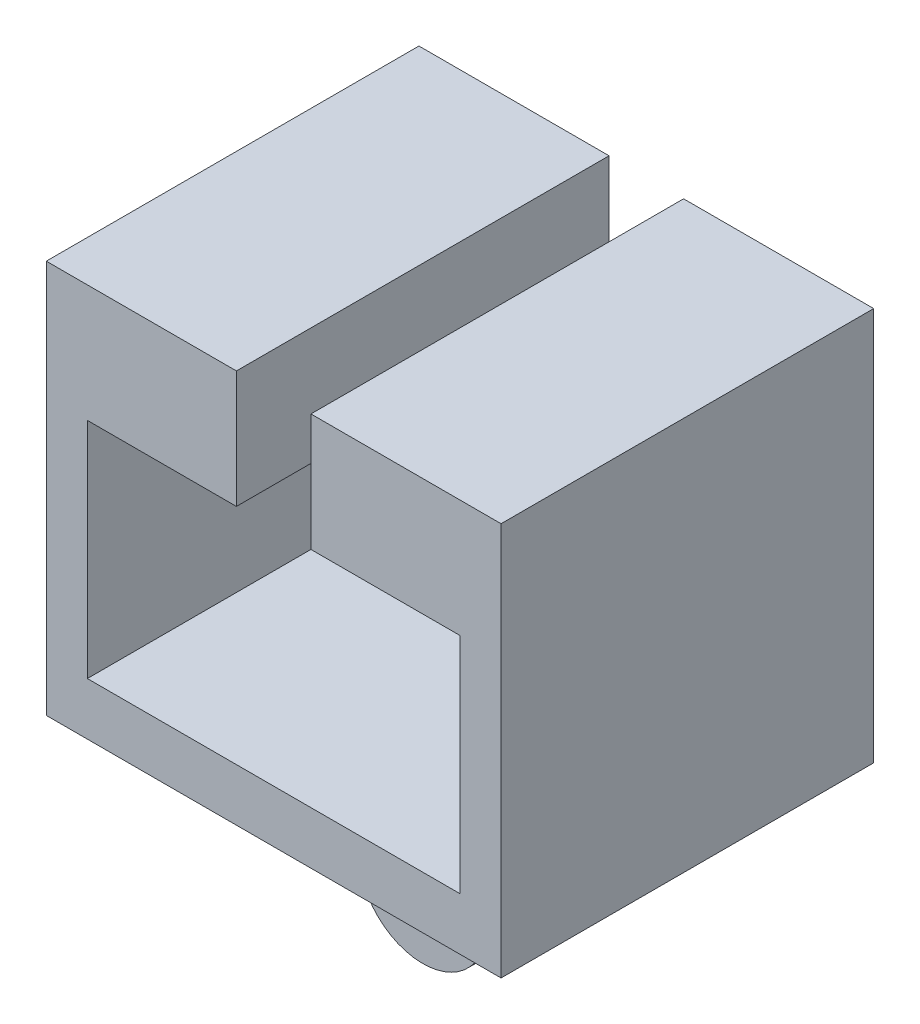
ISO-10303-21;
HEADER;
FILE_DESCRIPTION(('STEP AP214'),'2;1');
FILE_NAME('part.step','',(''),(''),'','','');
FILE_SCHEMA(('AUTOMOTIVE_DESIGN { 1 0 10303 214 1 1 1 1 }'));
ENDSEC;
DATA;
#1=APPLICATION_CONTEXT('core data for automotive mechanical design processes');
#2=APPLICATION_PROTOCOL_DEFINITION('international standard','automotive_design',2000,#1);
#3=PRODUCT_CONTEXT('',#1,'mechanical');
#4=PRODUCT('Part','Part','',(#3));
#5=PRODUCT_RELATED_PRODUCT_CATEGORY('part','',(#4));
#6=PRODUCT_DEFINITION_FORMATION('','',#4);
#7=PRODUCT_DEFINITION_CONTEXT('part definition',#1,'design');
#8=PRODUCT_DEFINITION('design','',#6,#7);
#9=PRODUCT_DEFINITION_SHAPE('','',#8);
#10=(LENGTH_UNIT() NAMED_UNIT(*) SI_UNIT(.MILLI.,.METRE.));
#11=(NAMED_UNIT(*) PLANE_ANGLE_UNIT() SI_UNIT($,.RADIAN.));
#12=(NAMED_UNIT(*) SI_UNIT($,.STERADIAN.) SOLID_ANGLE_UNIT());
#13=UNCERTAINTY_MEASURE_WITH_UNIT(LENGTH_MEASURE(1.E-05),#10,'distance_accuracy_value','');
#14=(GEOMETRIC_REPRESENTATION_CONTEXT(3) GLOBAL_UNCERTAINTY_ASSIGNED_CONTEXT((#13)) GLOBAL_UNIT_ASSIGNED_CONTEXT((#10,
#11,#12)) REPRESENTATION_CONTEXT('',''));
#15=CARTESIAN_POINT('',(0.,0.,0.));
#16=DIRECTION('',(0.,0.,1.));
#17=DIRECTION('',(1.,0.,0.));
#18=AXIS2_PLACEMENT_3D('',#15,#16,#17);
#19=CARTESIAN_POINT('',(0.,0.,-38.1));
#20=DIRECTION('',(0.,0.,1.));
#21=DIRECTION('',(1.,0.,0.));
#22=AXIS2_PLACEMENT_3D('',#19,#20,#21);
#23=CYLINDRICAL_SURFACE('',#22,10.8950456396128);
#24=DIRECTION('',(0.,0.,1.));
#25=VECTOR('',#24,1.);
#26=CARTESIAN_POINT('',(10.8950456396128,0.,-38.1));
#27=LINE('',#26,#25);
#28=CARTESIAN_POINT('',(10.8950456396128,0.,-35.6530617297002));
#29=VERTEX_POINT('',#28);
#30=CARTESIAN_POINT('',(10.8950456396128,0.,-38.1));
#31=VERTEX_POINT('',#30);
#32=EDGE_CURVE('E12',#29,#31,#27,.F.);
#33=ORIENTED_EDGE('',*,*,#32,.F.);
#34=CARTESIAN_POINT('',(0.,0.,-35.6530617297002));
#35=DIRECTION('',(0.,0.,-1.));
#36=DIRECTION('',(-1.,0.,0.));
#37=AXIS2_PLACEMENT_3D('',#34,#35,#36);
#38=CIRCLE('',#37,10.8950456396128);
#39=CARTESIAN_POINT('',(-10.8950456396128,0.,-35.6530617297002));
#40=VERTEX_POINT('',#39);
#41=EDGE_CURVE('E266',#29,#40,#38,.F.);
#42=ORIENTED_EDGE('',*,*,#41,.T.);
#43=DIRECTION('',(0.,0.,1.));
#44=VECTOR('',#43,1.);
#45=CARTESIAN_POINT('',(-10.8950456396128,0.,-38.1));
#46=LINE('',#45,#44);
#47=CARTESIAN_POINT('',(-10.8950456396128,0.,-38.1));
#48=VERTEX_POINT('',#47);
#49=EDGE_CURVE('E257',#48,#40,#46,.T.);
#50=ORIENTED_EDGE('',*,*,#49,.F.);
#51=CARTESIAN_POINT('',(0.,0.,-38.1));
#52=DIRECTION('',(0.,0.,1.));
#53=DIRECTION('',(1.,0.,0.));
#54=AXIS2_PLACEMENT_3D('',#51,#52,#53);
#55=CIRCLE('',#54,10.8950456396128);
#56=EDGE_CURVE('E563',#48,#31,#55,.T.);
#57=ORIENTED_EDGE('',*,*,#56,.T.);
#58=EDGE_LOOP('',(#33,#42,#50,#57));
#59=FACE_BOUND('',#58,.T.);
#60=CARTESIAN_POINT('',(0.,0.,0.));
#61=DIRECTION('',(0.,0.,1.));
#62=DIRECTION('',(1.,0.,0.));
#63=AXIS2_PLACEMENT_3D('',#60,#61,#62);
#64=CIRCLE('',#63,10.8950456396128);
#65=CARTESIAN_POINT('',(10.8950456396128,0.,0.));
#66=VERTEX_POINT('',#65);
#67=EDGE_CURVE('E552',#66,#66,#64,.T.);
#68=ORIENTED_EDGE('',*,*,#67,.F.);
#69=EDGE_LOOP('',(#68));
#70=FACE_BOUND('',#69,.T.);
#71=ADVANCED_FACE('F247',(#59,#70),#23,.T.);
#72=CARTESIAN_POINT('',(0.,0.,-38.1));
#73=DIRECTION('',(0.,0.,1.));
#74=DIRECTION('',(1.,0.,0.));
#75=AXIS2_PLACEMENT_3D('',#72,#73,#74);
#76=PLANE('',#75);
#77=ORIENTED_EDGE('',*,*,#56,.F.);
#78=DIRECTION('',(-1.,0.,0.));
#79=VECTOR('',#78,1.);
#80=CARTESIAN_POINT('',(11.176,0.,-38.1));
#81=LINE('',#80,#79);
#82=CARTESIAN_POINT('',(-11.176,0.,-38.1));
#83=VERTEX_POINT('',#82);
#84=EDGE_CURVE('E542',#48,#83,#81,.T.);
#85=ORIENTED_EDGE('',*,*,#84,.T.);
#86=DIRECTION('',(0.,1.,0.));
#87=VECTOR('',#86,1.);
#88=CARTESIAN_POINT('',(-11.176,0.,-38.1));
#89=LINE('',#88,#87);
#90=CARTESIAN_POINT('',(-11.176,19.05,-38.1));
#91=VERTEX_POINT('',#90);
#92=EDGE_CURVE('E528',#83,#91,#89,.T.);
#93=ORIENTED_EDGE('',*,*,#92,.T.);
#94=DIRECTION('',(-1.,0.,0.));
#95=VECTOR('',#94,1.);
#96=CARTESIAN_POINT('',(31.75,19.05,-38.1));
#97=LINE('',#96,#95);
#98=CARTESIAN_POINT('',(-38.7472451790634,19.05,-38.1));
#99=VERTEX_POINT('',#98);
#100=EDGE_CURVE('E512',#91,#99,#97,.T.);
#101=ORIENTED_EDGE('',*,*,#100,.T.);
#102=DIRECTION('',(0.,1.,0.));
#103=VECTOR('',#102,1.);
#104=CARTESIAN_POINT('',(-38.7472451790634,86.0903845049923,-38.1));
#105=LINE('',#104,#103);
#106=CARTESIAN_POINT('',(-38.7472451790634,86.0903845049923,-38.1));
#107=VERTEX_POINT('',#106);
#108=EDGE_CURVE('E416',#99,#107,#105,.T.);
#109=ORIENTED_EDGE('',*,*,#108,.T.);
#110=DIRECTION('',(1.,0.,0.));
#111=VECTOR('',#110,1.);
#112=CARTESIAN_POINT('',(-6.35,86.0903845049923,-38.1));
#113=LINE('',#112,#111);
#114=CARTESIAN_POINT('',(-6.35,86.0903845049923,-38.1));
#115=VERTEX_POINT('',#114);
#116=EDGE_CURVE('E473',#107,#115,#113,.T.);
#117=ORIENTED_EDGE('',*,*,#116,.T.);
#118=DIRECTION('',(0.,-1.,0.));
#119=VECTOR('',#118,1.);
#120=CARTESIAN_POINT('',(-6.35,66.093070635788,-38.1));
#121=LINE('',#120,#119);
#122=CARTESIAN_POINT('',(-6.35,66.093070635788,-38.1));
#123=VERTEX_POINT('',#122);
#124=EDGE_CURVE('E472',#115,#123,#121,.T.);
#125=ORIENTED_EDGE('',*,*,#124,.T.);
#126=DIRECTION('',(-1.,0.,0.));
#127=VECTOR('',#126,1.);
#128=CARTESIAN_POINT('',(-31.75,66.093070635788,-38.1));
#129=LINE('',#128,#127);
#130=CARTESIAN_POINT('',(-31.75,66.093070635788,-38.1));
#131=VERTEX_POINT('',#130);
#132=EDGE_CURVE('E467',#123,#131,#129,.T.);
#133=ORIENTED_EDGE('',*,*,#132,.T.);
#134=DIRECTION('',(0.,-1.,0.));
#135=VECTOR('',#134,1.);
#136=CARTESIAN_POINT('',(-31.75,27.993070635788,-38.1));
#137=LINE('',#136,#135);
#138=CARTESIAN_POINT('',(-31.75,27.993070635788,-38.1));
#139=VERTEX_POINT('',#138);
#140=EDGE_CURVE('E465',#131,#139,#137,.T.);
#141=ORIENTED_EDGE('',*,*,#140,.T.);
#142=DIRECTION('',(1.,0.,0.));
#143=VECTOR('',#142,1.);
#144=CARTESIAN_POINT('',(31.75,27.993070635788,-38.1));
#145=LINE('',#144,#143);
#146=CARTESIAN_POINT('',(31.75,27.993070635788,-38.1));
#147=VERTEX_POINT('',#146);
#148=EDGE_CURVE('E436',#139,#147,#145,.T.);
#149=ORIENTED_EDGE('',*,*,#148,.T.);
#150=DIRECTION('',(0.,1.,0.));
#151=VECTOR('',#150,1.);
#152=CARTESIAN_POINT('',(31.75,27.993070635788,-38.1));
#153=LINE('',#152,#151);
#154=CARTESIAN_POINT('',(31.75,66.093070635788,-38.1));
#155=VERTEX_POINT('',#154);
#156=EDGE_CURVE('E413',#147,#155,#153,.T.);
#157=ORIENTED_EDGE('',*,*,#156,.T.);
#158=DIRECTION('',(-1.,0.,0.));
#159=VECTOR('',#158,1.);
#160=CARTESIAN_POINT('',(31.75,66.093070635788,-38.1));
#161=LINE('',#160,#159);
#162=CARTESIAN_POINT('',(6.35,66.093070635788,-38.1));
#163=VERTEX_POINT('',#162);
#164=EDGE_CURVE('E392',#155,#163,#161,.T.);
#165=ORIENTED_EDGE('',*,*,#164,.T.);
#166=DIRECTION('',(0.,1.,0.));
#167=VECTOR('',#166,1.);
#168=CARTESIAN_POINT('',(6.35,66.093070635788,-38.1));
#169=LINE('',#168,#167);
#170=CARTESIAN_POINT('',(6.35,86.0903845049923,-38.1));
#171=VERTEX_POINT('',#170);
#172=EDGE_CURVE('E423',#163,#171,#169,.T.);
#173=ORIENTED_EDGE('',*,*,#172,.T.);
#174=DIRECTION('',(1.,0.,0.));
#175=VECTOR('',#174,1.);
#176=CARTESIAN_POINT('',(6.35,86.0903845049923,-38.1));
#177=LINE('',#176,#175);
#178=CARTESIAN_POINT('',(38.7472451790634,86.0903845049923,-38.1));
#179=VERTEX_POINT('',#178);
#180=EDGE_CURVE('E424',#171,#179,#177,.T.);
#181=ORIENTED_EDGE('',*,*,#180,.T.);
#182=DIRECTION('',(0.,-1.,0.));
#183=VECTOR('',#182,1.);
#184=CARTESIAN_POINT('',(38.7472451790634,19.05,-38.1));
#185=LINE('',#184,#183);
#186=CARTESIAN_POINT('',(38.7472451790634,19.05,-38.1));
#187=VERTEX_POINT('',#186);
#188=EDGE_CURVE('E383',#179,#187,#185,.T.);
#189=ORIENTED_EDGE('',*,*,#188,.T.);
#190=CARTESIAN_POINT('',(11.176,19.05,-38.1));
#191=VERTEX_POINT('',#190);
#192=EDGE_CURVE('E502',#187,#191,#97,.T.);
#193=ORIENTED_EDGE('',*,*,#192,.T.);
#194=DIRECTION('',(0.,-1.,0.));
#195=VECTOR('',#194,1.);
#196=CARTESIAN_POINT('',(11.176,0.,-38.1));
#197=LINE('',#196,#195);
#198=CARTESIAN_POINT('',(11.176,0.,-38.1));
#199=VERTEX_POINT('',#198);
#200=EDGE_CURVE('E520',#191,#199,#197,.T.);
#201=ORIENTED_EDGE('',*,*,#200,.T.);
#202=EDGE_CURVE('E545',#199,#31,#81,.T.);
#203=ORIENTED_EDGE('',*,*,#202,.T.);
#204=EDGE_LOOP('',(#77,#85,#93,#101,#109,#117,#125,#133,#141,#149,#157,#165,#173,#181,#189,#193,
#201,#203));
#205=FACE_BOUND('',#204,.T.);
#206=ADVANCED_FACE('F587',(#205),#76,.F.);
#207=CARTESIAN_POINT('',(0.,0.,0.));
#208=DIRECTION('',(0.,0.,1.));
#209=DIRECTION('',(1.,0.,0.));
#210=AXIS2_PLACEMENT_3D('',#207,#208,#209);
#211=PLANE('',#210);
#212=ORIENTED_EDGE('',*,*,#67,.T.);
#213=EDGE_LOOP('',(#212));
#214=FACE_BOUND('',#213,.T.);
#215=ADVANCED_FACE('F752',(#214),#211,.T.);
#216=CARTESIAN_POINT('',(11.176,0.,-35.6530617297002));
#217=DIRECTION('',(0.,-1.,0.));
#218=DIRECTION('',(1.,0.,0.));
#219=AXIS2_PLACEMENT_3D('',#216,#217,#218);
#220=PLANE('',#219);
#221=DIRECTION('',(-1.,0.,0.));
#222=VECTOR('',#221,1.);
#223=CARTESIAN_POINT('',(11.176,0.,-35.6530617297002));
#224=LINE('',#223,#222);
#225=CARTESIAN_POINT('',(11.176,0.,-35.6530617297002));
#226=VERTEX_POINT('',#225);
#227=EDGE_CURVE('E527',#226,#29,#224,.T.);
#228=ORIENTED_EDGE('',*,*,#227,.T.);
#229=ORIENTED_EDGE('',*,*,#32,.T.);
#230=ORIENTED_EDGE('',*,*,#202,.F.);
#231=DIRECTION('',(0.,0.,-1.));
#232=VECTOR('',#231,1.);
#233=CARTESIAN_POINT('',(11.176,0.,-35.6530617297002));
#234=LINE('',#233,#232);
#235=EDGE_CURVE('E560',#226,#199,#234,.T.);
#236=ORIENTED_EDGE('',*,*,#235,.F.);
#237=EDGE_LOOP('',(#228,#229,#230,#236));
#238=FACE_BOUND('',#237,.T.);
#239=ADVANCED_FACE('F581',(#238),#220,.T.);
#240=CARTESIAN_POINT('',(-11.176,0.,-35.6530617297002));
#241=DIRECTION('',(-1.,0.,0.));
#242=DIRECTION('',(0.,-1.,0.));
#243=AXIS2_PLACEMENT_3D('',#240,#241,#242);
#244=PLANE('',#243);
#245=ORIENTED_EDGE('',*,*,#92,.F.);
#246=DIRECTION('',(0.,0.,-1.));
#247=VECTOR('',#246,1.);
#248=CARTESIAN_POINT('',(-11.176,0.,-35.6530617297002));
#249=LINE('',#248,#247);
#250=CARTESIAN_POINT('',(-11.176,0.,-35.6530617297002));
#251=VERTEX_POINT('',#250);
#252=EDGE_CURVE('E551',#251,#83,#249,.T.);
#253=ORIENTED_EDGE('',*,*,#252,.F.);
#254=DIRECTION('',(0.,1.,0.));
#255=VECTOR('',#254,1.);
#256=CARTESIAN_POINT('',(-11.176,0.,-35.6530617297002));
#257=LINE('',#256,#255);
#258=CARTESIAN_POINT('',(-11.176,19.05,-35.6530617297002));
#259=VERTEX_POINT('',#258);
#260=EDGE_CURVE('E531',#251,#259,#257,.T.);
#261=ORIENTED_EDGE('',*,*,#260,.T.);
#262=DIRECTION('',(0.,0.,-1.));
#263=VECTOR('',#262,1.);
#264=CARTESIAN_POINT('',(-11.176,19.05,-35.6530617297002));
#265=LINE('',#264,#263);
#266=EDGE_CURVE('E549',#259,#91,#265,.T.);
#267=ORIENTED_EDGE('',*,*,#266,.T.);
#268=EDGE_LOOP('',(#245,#253,#261,#267));
#269=FACE_BOUND('',#268,.T.);
#270=ADVANCED_FACE('F596',(#269),#244,.T.);
#271=ORIENTED_EDGE('',*,*,#84,.F.);
#272=ORIENTED_EDGE('',*,*,#49,.T.);
#273=EDGE_CURVE('E264',#40,#251,#224,.T.);
#274=ORIENTED_EDGE('',*,*,#273,.T.);
#275=ORIENTED_EDGE('',*,*,#252,.T.);
#276=EDGE_LOOP('',(#271,#272,#274,#275));
#277=FACE_BOUND('',#276,.T.);
#278=ADVANCED_FACE('F577',(#277),#220,.T.);
#279=CARTESIAN_POINT('',(11.176,0.,-35.6530617297002));
#280=DIRECTION('',(1.,0.,0.));
#281=DIRECTION('',(0.,0.,-1.));
#282=AXIS2_PLACEMENT_3D('',#279,#280,#281);
#283=PLANE('',#282);
#284=ORIENTED_EDGE('',*,*,#200,.F.);
#285=DIRECTION('',(0.,0.,-1.));
#286=VECTOR('',#285,1.);
#287=CARTESIAN_POINT('',(11.176,19.05,-35.6530617297002));
#288=LINE('',#287,#286);
#289=CARTESIAN_POINT('',(11.176,19.05,-35.6530617297002));
#290=VERTEX_POINT('',#289);
#291=EDGE_CURVE('E540',#290,#191,#288,.T.);
#292=ORIENTED_EDGE('',*,*,#291,.F.);
#293=DIRECTION('',(0.,-1.,0.));
#294=VECTOR('',#293,1.);
#295=CARTESIAN_POINT('',(11.176,0.,-35.6530617297002));
#296=LINE('',#295,#294);
#297=EDGE_CURVE('E523',#290,#226,#296,.T.);
#298=ORIENTED_EDGE('',*,*,#297,.T.);
#299=ORIENTED_EDGE('',*,*,#235,.T.);
#300=EDGE_LOOP('',(#284,#292,#298,#299));
#301=FACE_BOUND('',#300,.T.);
#302=ADVANCED_FACE('F589',(#301),#283,.T.);
#303=CARTESIAN_POINT('',(0.,0.,-35.6530617297002));
#304=DIRECTION('',(0.,0.,-1.));
#305=DIRECTION('',(-1.,0.,0.));
#306=AXIS2_PLACEMENT_3D('',#303,#304,#305);
#307=PLANE('',#306);
#308=ORIENTED_EDGE('',*,*,#41,.F.);
#309=ORIENTED_EDGE('',*,*,#227,.F.);
#310=ORIENTED_EDGE('',*,*,#297,.F.);
#311=DIRECTION('',(1.,0.,0.));
#312=VECTOR('',#311,1.);
#313=CARTESIAN_POINT('',(11.176,19.05,-35.6530617297002));
#314=LINE('',#313,#312);
#315=EDGE_CURVE('E522',#259,#290,#314,.T.);
#316=ORIENTED_EDGE('',*,*,#315,.F.);
#317=ORIENTED_EDGE('',*,*,#260,.F.);
#318=ORIENTED_EDGE('',*,*,#273,.F.);
#319=EDGE_LOOP('',(#308,#309,#310,#316,#317,#318));
#320=FACE_BOUND('',#319,.T.);
#321=ADVANCED_FACE('F592',(#320),#307,.F.);
#322=CARTESIAN_POINT('',(31.75,19.05,25.4));
#323=DIRECTION('',(0.,-1.,0.));
#324=DIRECTION('',(0.,0.,-1.));
#325=AXIS2_PLACEMENT_3D('',#322,#323,#324);
#326=PLANE('',#325);
#327=ORIENTED_EDGE('',*,*,#266,.F.);
#328=ORIENTED_EDGE('',*,*,#315,.T.);
#329=ORIENTED_EDGE('',*,*,#291,.T.);
#330=ORIENTED_EDGE('',*,*,#192,.F.);
#331=DIRECTION('',(0.,0.,-1.));
#332=VECTOR('',#331,1.);
#333=CARTESIAN_POINT('',(38.7472451790634,19.05,25.4));
#334=LINE('',#333,#332);
#335=CARTESIAN_POINT('',(38.7472451790634,19.05,25.4));
#336=VERTEX_POINT('',#335);
#337=EDGE_CURVE('E435',#336,#187,#334,.T.);
#338=ORIENTED_EDGE('',*,*,#337,.F.);
#339=DIRECTION('',(-1.,0.,0.));
#340=VECTOR('',#339,1.);
#341=CARTESIAN_POINT('',(31.75,19.05,25.4));
#342=LINE('',#341,#340);
#343=CARTESIAN_POINT('',(-38.7472451790634,19.05,25.4));
#344=VERTEX_POINT('',#343);
#345=EDGE_CURVE('E503',#336,#344,#342,.T.);
#346=ORIENTED_EDGE('',*,*,#345,.T.);
#347=DIRECTION('',(0.,0.,-1.));
#348=VECTOR('',#347,1.);
#349=CARTESIAN_POINT('',(-38.7472451790634,19.05,25.4));
#350=LINE('',#349,#348);
#351=EDGE_CURVE('E444',#344,#99,#350,.T.);
#352=ORIENTED_EDGE('',*,*,#351,.T.);
#353=ORIENTED_EDGE('',*,*,#100,.F.);
#354=EDGE_LOOP('',(#327,#328,#329,#330,#338,#346,#352,#353));
#355=FACE_BOUND('',#354,.T.);
#356=ADVANCED_FACE('F595',(#355),#326,.T.);
#357=CARTESIAN_POINT('',(31.75,27.993070635788,25.4));
#358=DIRECTION('',(0.,1.,0.));
#359=DIRECTION('',(0.,0.,1.));
#360=AXIS2_PLACEMENT_3D('',#357,#358,#359);
#361=PLANE('',#360);
#362=ORIENTED_EDGE('',*,*,#148,.F.);
#363=DIRECTION('',(0.,0.,-1.));
#364=VECTOR('',#363,1.);
#365=CARTESIAN_POINT('',(-31.75,27.993070635788,25.4));
#366=LINE('',#365,#364);
#367=CARTESIAN_POINT('',(-31.75,27.993070635788,25.4));
#368=VERTEX_POINT('',#367);
#369=EDGE_CURVE('E510',#368,#139,#366,.T.);
#370=ORIENTED_EDGE('',*,*,#369,.F.);
#371=DIRECTION('',(1.,0.,0.));
#372=VECTOR('',#371,1.);
#373=CARTESIAN_POINT('',(31.75,27.993070635788,25.4));
#374=LINE('',#373,#372);
#375=CARTESIAN_POINT('',(31.75,27.993070635788,25.4));
#376=VERTEX_POINT('',#375);
#377=EDGE_CURVE('E499',#368,#376,#374,.T.);
#378=ORIENTED_EDGE('',*,*,#377,.T.);
#379=DIRECTION('',(0.,0.,-1.));
#380=VECTOR('',#379,1.);
#381=CARTESIAN_POINT('',(31.75,27.993070635788,25.4));
#382=LINE('',#381,#380);
#383=EDGE_CURVE('E377',#376,#147,#382,.T.);
#384=ORIENTED_EDGE('',*,*,#383,.T.);
#385=EDGE_LOOP('',(#362,#370,#378,#384));
#386=FACE_BOUND('',#385,.T.);
#387=ADVANCED_FACE('F728',(#386),#361,.T.);
#388=CARTESIAN_POINT('',(0.,0.,25.4));
#389=DIRECTION('',(0.,0.,1.));
#390=DIRECTION('',(1.,0.,0.));
#391=AXIS2_PLACEMENT_3D('',#388,#389,#390);
#392=PLANE('',#391);
#393=ORIENTED_EDGE('',*,*,#377,.F.);
#394=DIRECTION('',(0.,-1.,0.));
#395=VECTOR('',#394,1.);
#396=CARTESIAN_POINT('',(-31.75,19.05,25.4));
#397=LINE('',#396,#395);
#398=CARTESIAN_POINT('',(-31.75,66.093070635788,25.4));
#399=VERTEX_POINT('',#398);
#400=EDGE_CURVE('E470',#399,#368,#397,.T.);
#401=ORIENTED_EDGE('',*,*,#400,.F.);
#402=DIRECTION('',(-1.,0.,0.));
#403=VECTOR('',#402,1.);
#404=CARTESIAN_POINT('',(-31.75,66.093070635788,25.4));
#405=LINE('',#404,#403);
#406=CARTESIAN_POINT('',(-6.35,66.093070635788,25.4));
#407=VERTEX_POINT('',#406);
#408=EDGE_CURVE('E446',#407,#399,#405,.T.);
#409=ORIENTED_EDGE('',*,*,#408,.F.);
#410=DIRECTION('',(0.,-1.,0.));
#411=VECTOR('',#410,1.);
#412=CARTESIAN_POINT('',(-6.35,66.093070635788,25.4));
#413=LINE('',#412,#411);
#414=CARTESIAN_POINT('',(-6.35,86.0903845049923,25.4));
#415=VERTEX_POINT('',#414);
#416=EDGE_CURVE('E482',#415,#407,#413,.T.);
#417=ORIENTED_EDGE('',*,*,#416,.F.);
#418=DIRECTION('',(1.,0.,0.));
#419=VECTOR('',#418,1.);
#420=CARTESIAN_POINT('',(-6.35,86.0903845049923,25.4));
#421=LINE('',#420,#419);
#422=CARTESIAN_POINT('',(-38.7472451790634,86.0903845049923,25.4));
#423=VERTEX_POINT('',#422);
#424=EDGE_CURVE('E490',#423,#415,#421,.T.);
#425=ORIENTED_EDGE('',*,*,#424,.F.);
#426=DIRECTION('',(0.,1.,0.));
#427=VECTOR('',#426,1.);
#428=CARTESIAN_POINT('',(-38.7472451790634,86.0903845049923,25.4));
#429=LINE('',#428,#427);
#430=EDGE_CURVE('E491',#344,#423,#429,.T.);
#431=ORIENTED_EDGE('',*,*,#430,.F.);
#432=ORIENTED_EDGE('',*,*,#345,.F.);
#433=DIRECTION('',(0.,-1.,0.));
#434=VECTOR('',#433,1.);
#435=CARTESIAN_POINT('',(38.7472451790634,19.05,25.4));
#436=LINE('',#435,#434);
#437=CARTESIAN_POINT('',(38.7472451790634,86.0903845049923,25.4));
#438=VERTEX_POINT('',#437);
#439=EDGE_CURVE('E391',#438,#336,#436,.T.);
#440=ORIENTED_EDGE('',*,*,#439,.F.);
#441=DIRECTION('',(1.,0.,0.));
#442=VECTOR('',#441,1.);
#443=CARTESIAN_POINT('',(6.35,86.0903845049923,25.4));
#444=LINE('',#443,#442);
#445=CARTESIAN_POINT('',(6.35,86.0903845049923,25.4));
#446=VERTEX_POINT('',#445);
#447=EDGE_CURVE('E407',#446,#438,#444,.T.);
#448=ORIENTED_EDGE('',*,*,#447,.F.);
#449=DIRECTION('',(0.,1.,0.));
#450=VECTOR('',#449,1.);
#451=CARTESIAN_POINT('',(6.35,66.093070635788,25.4));
#452=LINE('',#451,#450);
#453=CARTESIAN_POINT('',(6.35,66.093070635788,25.4));
#454=VERTEX_POINT('',#453);
#455=EDGE_CURVE('E397',#454,#446,#452,.T.);
#456=ORIENTED_EDGE('',*,*,#455,.F.);
#457=DIRECTION('',(-1.,0.,0.));
#458=VECTOR('',#457,1.);
#459=CARTESIAN_POINT('',(31.75,66.093070635788,25.4));
#460=LINE('',#459,#458);
#461=CARTESIAN_POINT('',(31.75,66.093070635788,25.4));
#462=VERTEX_POINT('',#461);
#463=EDGE_CURVE('E381',#462,#454,#460,.T.);
#464=ORIENTED_EDGE('',*,*,#463,.F.);
#465=DIRECTION('',(0.,1.,0.));
#466=VECTOR('',#465,1.);
#467=CARTESIAN_POINT('',(31.75,19.05,25.4));
#468=LINE('',#467,#466);
#469=EDGE_CURVE('E375',#376,#462,#468,.T.);
#470=ORIENTED_EDGE('',*,*,#469,.F.);
#471=EDGE_LOOP('',(#393,#401,#409,#417,#425,#431,#432,#440,#448,#456,#464,#470));
#472=FACE_BOUND('',#471,.T.);
#473=ADVANCED_FACE('F400',(#472),#392,.T.);
#474=CARTESIAN_POINT('',(31.75,27.993070635788,25.4));
#475=DIRECTION('',(-1.,0.,0.));
#476=DIRECTION('',(0.,0.,1.));
#477=AXIS2_PLACEMENT_3D('',#474,#475,#476);
#478=PLANE('',#477);
#479=ORIENTED_EDGE('',*,*,#383,.F.);
#480=ORIENTED_EDGE('',*,*,#469,.T.);
#481=DIRECTION('',(0.,0.,-1.));
#482=VECTOR('',#481,1.);
#483=CARTESIAN_POINT('',(31.75,66.093070635788,25.4));
#484=LINE('',#483,#482);
#485=EDGE_CURVE('E374',#462,#155,#484,.T.);
#486=ORIENTED_EDGE('',*,*,#485,.T.);
#487=ORIENTED_EDGE('',*,*,#156,.F.);
#488=EDGE_LOOP('',(#479,#480,#486,#487));
#489=FACE_BOUND('',#488,.T.);
#490=ADVANCED_FACE('F372',(#489),#478,.T.);
#491=CARTESIAN_POINT('',(38.7472451790634,19.05,25.4));
#492=DIRECTION('',(1.,0.,0.));
#493=DIRECTION('',(0.,0.,-1.));
#494=AXIS2_PLACEMENT_3D('',#491,#492,#493);
#495=PLANE('',#494);
#496=ORIENTED_EDGE('',*,*,#188,.F.);
#497=DIRECTION('',(0.,0.,-1.));
#498=VECTOR('',#497,1.);
#499=CARTESIAN_POINT('',(38.7472451790634,86.0903845049923,25.4));
#500=LINE('',#499,#498);
#501=EDGE_CURVE('E440',#438,#179,#500,.T.);
#502=ORIENTED_EDGE('',*,*,#501,.F.);
#503=ORIENTED_EDGE('',*,*,#439,.T.);
#504=ORIENTED_EDGE('',*,*,#337,.T.);
#505=EDGE_LOOP('',(#496,#502,#503,#504));
#506=FACE_BOUND('',#505,.T.);
#507=ADVANCED_FACE('F731',(#506),#495,.T.);
#508=CARTESIAN_POINT('',(6.35,86.0903845049923,25.4));
#509=DIRECTION('',(0.,1.,0.));
#510=DIRECTION('',(0.,0.,1.));
#511=AXIS2_PLACEMENT_3D('',#508,#509,#510);
#512=PLANE('',#511);
#513=ORIENTED_EDGE('',*,*,#180,.F.);
#514=DIRECTION('',(0.,0.,-1.));
#515=VECTOR('',#514,1.);
#516=CARTESIAN_POINT('',(6.35,86.0903845049923,25.4));
#517=LINE('',#516,#515);
#518=EDGE_CURVE('E439',#446,#171,#517,.T.);
#519=ORIENTED_EDGE('',*,*,#518,.F.);
#520=ORIENTED_EDGE('',*,*,#447,.T.);
#521=ORIENTED_EDGE('',*,*,#501,.T.);
#522=EDGE_LOOP('',(#513,#519,#520,#521));
#523=FACE_BOUND('',#522,.T.);
#524=ADVANCED_FACE('F740',(#523),#512,.T.);
#525=CARTESIAN_POINT('',(6.35,66.093070635788,25.4));
#526=DIRECTION('',(-1.,0.,0.));
#527=DIRECTION('',(0.,0.,1.));
#528=AXIS2_PLACEMENT_3D('',#525,#526,#527);
#529=PLANE('',#528);
#530=ORIENTED_EDGE('',*,*,#172,.F.);
#531=DIRECTION('',(0.,0.,-1.));
#532=VECTOR('',#531,1.);
#533=CARTESIAN_POINT('',(6.35,66.093070635788,25.4));
#534=LINE('',#533,#532);
#535=EDGE_CURVE('E394',#454,#163,#534,.T.);
#536=ORIENTED_EDGE('',*,*,#535,.F.);
#537=ORIENTED_EDGE('',*,*,#455,.T.);
#538=ORIENTED_EDGE('',*,*,#518,.T.);
#539=EDGE_LOOP('',(#530,#536,#537,#538));
#540=FACE_BOUND('',#539,.T.);
#541=ADVANCED_FACE('F738',(#540),#529,.T.);
#542=CARTESIAN_POINT('',(31.75,66.093070635788,25.4));
#543=DIRECTION('',(0.,-1.,0.));
#544=DIRECTION('',(0.,0.,-1.));
#545=AXIS2_PLACEMENT_3D('',#542,#543,#544);
#546=PLANE('',#545);
#547=ORIENTED_EDGE('',*,*,#164,.F.);
#548=ORIENTED_EDGE('',*,*,#485,.F.);
#549=ORIENTED_EDGE('',*,*,#463,.T.);
#550=ORIENTED_EDGE('',*,*,#535,.T.);
#551=EDGE_LOOP('',(#547,#548,#549,#550));
#552=FACE_BOUND('',#551,.T.);
#553=ADVANCED_FACE('F386',(#552),#546,.T.);
#554=CARTESIAN_POINT('',(-31.75,27.993070635788,25.4));
#555=DIRECTION('',(1.,0.,0.));
#556=DIRECTION('',(0.,0.,-1.));
#557=AXIS2_PLACEMENT_3D('',#554,#555,#556);
#558=PLANE('',#557);
#559=ORIENTED_EDGE('',*,*,#400,.T.);
#560=ORIENTED_EDGE('',*,*,#369,.T.);
#561=ORIENTED_EDGE('',*,*,#140,.F.);
#562=DIRECTION('',(0.,0.,-1.));
#563=VECTOR('',#562,1.);
#564=CARTESIAN_POINT('',(-31.75,66.093070635788,25.4));
#565=LINE('',#564,#563);
#566=EDGE_CURVE('E456',#399,#131,#565,.T.);
#567=ORIENTED_EDGE('',*,*,#566,.F.);
#568=EDGE_LOOP('',(#559,#560,#561,#567));
#569=FACE_BOUND('',#568,.T.);
#570=ADVANCED_FACE('F726',(#569),#558,.T.);
#571=CARTESIAN_POINT('',(-31.75,66.093070635788,25.4));
#572=DIRECTION('',(0.,-1.,0.));
#573=DIRECTION('',(0.,0.,-1.));
#574=AXIS2_PLACEMENT_3D('',#571,#572,#573);
#575=PLANE('',#574);
#576=ORIENTED_EDGE('',*,*,#132,.F.);
#577=DIRECTION('',(0.,0.,-1.));
#578=VECTOR('',#577,1.);
#579=CARTESIAN_POINT('',(-6.35,66.093070635788,25.4));
#580=LINE('',#579,#578);
#581=EDGE_CURVE('E457',#407,#123,#580,.T.);
#582=ORIENTED_EDGE('',*,*,#581,.F.);
#583=ORIENTED_EDGE('',*,*,#408,.T.);
#584=ORIENTED_EDGE('',*,*,#566,.T.);
#585=EDGE_LOOP('',(#576,#582,#583,#584));
#586=FACE_BOUND('',#585,.T.);
#587=ADVANCED_FACE('F724',(#586),#575,.T.);
#588=CARTESIAN_POINT('',(-6.35,66.093070635788,25.4));
#589=DIRECTION('',(1.,0.,0.));
#590=DIRECTION('',(0.,1.,0.));
#591=AXIS2_PLACEMENT_3D('',#588,#589,#590);
#592=PLANE('',#591);
#593=ORIENTED_EDGE('',*,*,#124,.F.);
#594=DIRECTION('',(0.,0.,-1.));
#595=VECTOR('',#594,1.);
#596=CARTESIAN_POINT('',(-6.35,86.0903845049923,25.4));
#597=LINE('',#596,#595);
#598=EDGE_CURVE('E454',#415,#115,#597,.T.);
#599=ORIENTED_EDGE('',*,*,#598,.F.);
#600=ORIENTED_EDGE('',*,*,#416,.T.);
#601=ORIENTED_EDGE('',*,*,#581,.T.);
#602=EDGE_LOOP('',(#593,#599,#600,#601));
#603=FACE_BOUND('',#602,.T.);
#604=ADVANCED_FACE('F718',(#603),#592,.T.);
#605=CARTESIAN_POINT('',(-6.35,86.0903845049923,25.4));
#606=DIRECTION('',(0.,1.,0.));
#607=DIRECTION('',(0.,0.,1.));
#608=AXIS2_PLACEMENT_3D('',#605,#606,#607);
#609=PLANE('',#608);
#610=ORIENTED_EDGE('',*,*,#116,.F.);
#611=DIRECTION('',(0.,0.,-1.));
#612=VECTOR('',#611,1.);
#613=CARTESIAN_POINT('',(-38.7472451790634,86.0903845049923,25.4));
#614=LINE('',#613,#612);
#615=EDGE_CURVE('E448',#423,#107,#614,.T.);
#616=ORIENTED_EDGE('',*,*,#615,.F.);
#617=ORIENTED_EDGE('',*,*,#424,.T.);
#618=ORIENTED_EDGE('',*,*,#598,.T.);
#619=EDGE_LOOP('',(#610,#616,#617,#618));
#620=FACE_BOUND('',#619,.T.);
#621=ADVANCED_FACE('F717',(#620),#609,.T.);
#622=CARTESIAN_POINT('',(-38.7472451790634,86.0903845049923,25.4));
#623=DIRECTION('',(-1.,0.,0.));
#624=DIRECTION('',(0.,-1.,0.));
#625=AXIS2_PLACEMENT_3D('',#622,#623,#624);
#626=PLANE('',#625);
#627=ORIENTED_EDGE('',*,*,#108,.F.);
#628=ORIENTED_EDGE('',*,*,#351,.F.);
#629=ORIENTED_EDGE('',*,*,#430,.T.);
#630=ORIENTED_EDGE('',*,*,#615,.T.);
#631=EDGE_LOOP('',(#627,#628,#629,#630));
#632=FACE_BOUND('',#631,.T.);
#633=ADVANCED_FACE('F715',(#632),#626,.T.);
#634=CLOSED_SHELL('',(#71,#206,#215,#239,#270,#278,#302,#321,#356,#387,#473,#490,#507,#524,#541,
#553,#570,#587,#604,#621,#633));
#635=MANIFOLD_SOLID_BREP('B2',#634);
#636=ADVANCED_BREP_SHAPE_REPRESENTATION('',(#18,#635),#14);
#637=SHAPE_DEFINITION_REPRESENTATION(#9,#636);
ENDSEC;
END-ISO-10303-21;
